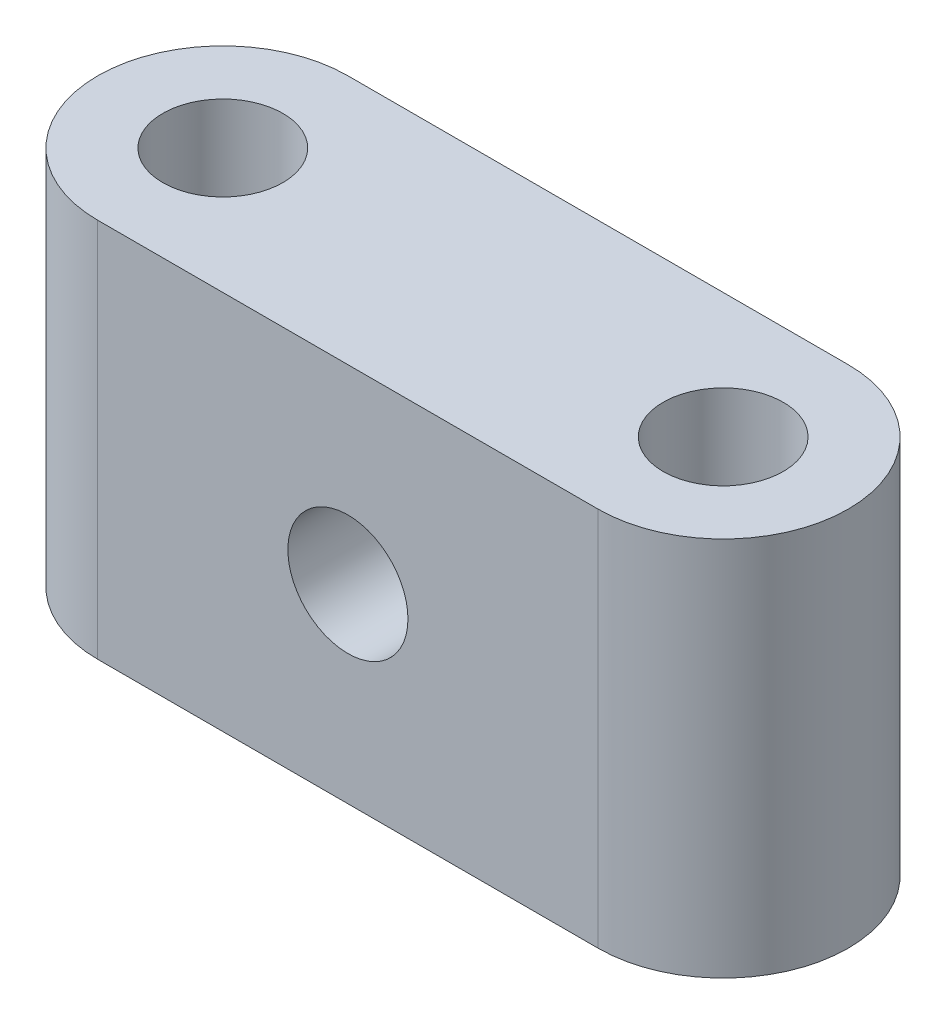
ISO-10303-21;
HEADER;
FILE_DESCRIPTION(('STEP AP214'),'2;1');
FILE_NAME('part.step','',(''),(''),'','','');
FILE_SCHEMA(('AUTOMOTIVE_DESIGN { 1 0 10303 214 1 1 1 1 }'));
ENDSEC;
DATA;
#1=APPLICATION_CONTEXT('core data for automotive mechanical design processes');
#2=APPLICATION_PROTOCOL_DEFINITION('international standard','automotive_design',2000,#1);
#3=PRODUCT_CONTEXT('',#1,'mechanical');
#4=PRODUCT('Part','Part','',(#3));
#5=PRODUCT_RELATED_PRODUCT_CATEGORY('part','',(#4));
#6=PRODUCT_DEFINITION_FORMATION('','',#4);
#7=PRODUCT_DEFINITION_CONTEXT('part definition',#1,'design');
#8=PRODUCT_DEFINITION('design','',#6,#7);
#9=PRODUCT_DEFINITION_SHAPE('','',#8);
#10=(LENGTH_UNIT() NAMED_UNIT(*) SI_UNIT(.MILLI.,.METRE.));
#11=(NAMED_UNIT(*) PLANE_ANGLE_UNIT() SI_UNIT($,.RADIAN.));
#12=(NAMED_UNIT(*) SI_UNIT($,.STERADIAN.) SOLID_ANGLE_UNIT());
#13=UNCERTAINTY_MEASURE_WITH_UNIT(LENGTH_MEASURE(1.E-05),#10,'distance_accuracy_value','');
#14=(GEOMETRIC_REPRESENTATION_CONTEXT(3) GLOBAL_UNCERTAINTY_ASSIGNED_CONTEXT((#13)) GLOBAL_UNIT_ASSIGNED_CONTEXT((#10,
#11,#12)) REPRESENTATION_CONTEXT('',''));
#15=CARTESIAN_POINT('',(0.,0.,0.));
#16=DIRECTION('',(0.,0.,1.));
#17=DIRECTION('',(1.,0.,0.));
#18=AXIS2_PLACEMENT_3D('',#15,#16,#17);
#19=CARTESIAN_POINT('',(0.,38.,0.));
#20=DIRECTION('',(0.,1.,0.));
#21=DIRECTION('',(0.,0.,1.));
#22=AXIS2_PLACEMENT_3D('',#19,#20,#21);
#23=PLANE('',#22);
#24=CARTESIAN_POINT('',(0.,38.,0.));
#25=DIRECTION('',(0.,1.,0.));
#26=DIRECTION('',(0.,0.,1.));
#27=AXIS2_PLACEMENT_3D('',#24,#25,#26);
#28=CIRCLE('',#27,6.);
#29=CARTESIAN_POINT('',(0.,38.,6.));
#30=VERTEX_POINT('',#29);
#31=EDGE_CURVE('E100',#30,#30,#28,.T.);
#32=ORIENTED_EDGE('',*,*,#31,.F.);
#33=EDGE_LOOP('',(#32));
#34=FACE_BOUND('',#33,.T.);
#35=CARTESIAN_POINT('',(0.,38.,0.));
#36=DIRECTION('',(0.,1.,0.));
#37=DIRECTION('',(0.,0.,1.));
#38=AXIS2_PLACEMENT_3D('',#35,#36,#37);
#39=CIRCLE('',#38,12.5);
#40=CARTESIAN_POINT('',(0.,38.,-12.5));
#41=VERTEX_POINT('',#40);
#42=CARTESIAN_POINT('',(0.,38.,12.5));
#43=VERTEX_POINT('',#42);
#44=EDGE_CURVE('E85',#41,#43,#39,.T.);
#45=ORIENTED_EDGE('',*,*,#44,.T.);
#46=DIRECTION('',(1.,0.,0.));
#47=VECTOR('',#46,1.);
#48=CARTESIAN_POINT('',(0.,38.,12.5));
#49=LINE('',#48,#47);
#50=CARTESIAN_POINT('',(50.,38.,12.5));
#51=VERTEX_POINT('',#50);
#52=EDGE_CURVE('E80',#43,#51,#49,.T.);
#53=ORIENTED_EDGE('',*,*,#52,.T.);
#54=CARTESIAN_POINT('',(50.,38.,0.));
#55=DIRECTION('',(0.,1.,0.));
#56=DIRECTION('',(0.,0.,1.));
#57=AXIS2_PLACEMENT_3D('',#54,#55,#56);
#58=CIRCLE('',#57,12.5);
#59=CARTESIAN_POINT('',(50.,38.,-12.5));
#60=VERTEX_POINT('',#59);
#61=EDGE_CURVE('E83',#51,#60,#58,.T.);
#62=ORIENTED_EDGE('',*,*,#61,.T.);
#63=DIRECTION('',(-1.,0.,0.));
#64=VECTOR('',#63,1.);
#65=CARTESIAN_POINT('',(0.,38.,-12.5));
#66=LINE('',#65,#64);
#67=EDGE_CURVE('E50',#60,#41,#66,.T.);
#68=ORIENTED_EDGE('',*,*,#67,.T.);
#69=EDGE_LOOP('',(#45,#53,#62,#68));
#70=FACE_BOUND('',#69,.T.);
#71=CARTESIAN_POINT('',(50.,38.,0.));
#72=DIRECTION('',(0.,1.,0.));
#73=DIRECTION('',(0.,0.,1.));
#74=AXIS2_PLACEMENT_3D('',#71,#72,#73);
#75=CIRCLE('',#74,6.);
#76=CARTESIAN_POINT('',(50.,38.,6.));
#77=VERTEX_POINT('',#76);
#78=EDGE_CURVE('E115',#77,#77,#75,.T.);
#79=ORIENTED_EDGE('',*,*,#78,.F.);
#80=EDGE_LOOP('',(#79));
#81=FACE_BOUND('',#80,.T.);
#82=ADVANCED_FACE('F33',(#34,#70,#81),#23,.T.);
#83=CARTESIAN_POINT('',(0.,0.,0.));
#84=DIRECTION('',(0.,1.,0.));
#85=DIRECTION('',(0.,0.,1.));
#86=AXIS2_PLACEMENT_3D('',#83,#84,#85);
#87=PLANE('',#86);
#88=CARTESIAN_POINT('',(0.,0.,0.));
#89=DIRECTION('',(0.,1.,0.));
#90=DIRECTION('',(0.,0.,1.));
#91=AXIS2_PLACEMENT_3D('',#88,#89,#90);
#92=CIRCLE('',#91,12.5);
#93=CARTESIAN_POINT('',(0.,0.,-12.5));
#94=VERTEX_POINT('',#93);
#95=CARTESIAN_POINT('',(0.,0.,12.5));
#96=VERTEX_POINT('',#95);
#97=EDGE_CURVE('E97',#94,#96,#92,.T.);
#98=ORIENTED_EDGE('',*,*,#97,.F.);
#99=DIRECTION('',(-1.,0.,0.));
#100=VECTOR('',#99,1.);
#101=CARTESIAN_POINT('',(0.,0.,-12.5));
#102=LINE('',#101,#100);
#103=CARTESIAN_POINT('',(50.,0.,-12.5));
#104=VERTEX_POINT('',#103);
#105=EDGE_CURVE('E73',#104,#94,#102,.T.);
#106=ORIENTED_EDGE('',*,*,#105,.F.);
#107=CARTESIAN_POINT('',(50.,0.,0.));
#108=DIRECTION('',(0.,1.,0.));
#109=DIRECTION('',(0.,0.,1.));
#110=AXIS2_PLACEMENT_3D('',#107,#108,#109);
#111=CIRCLE('',#110,12.5);
#112=CARTESIAN_POINT('',(50.,0.,12.5));
#113=VERTEX_POINT('',#112);
#114=EDGE_CURVE('E67',#113,#104,#111,.T.);
#115=ORIENTED_EDGE('',*,*,#114,.F.);
#116=DIRECTION('',(1.,0.,0.));
#117=VECTOR('',#116,1.);
#118=CARTESIAN_POINT('',(0.,0.,12.5));
#119=LINE('',#118,#117);
#120=EDGE_CURVE('E89',#96,#113,#119,.T.);
#121=ORIENTED_EDGE('',*,*,#120,.F.);
#122=EDGE_LOOP('',(#98,#106,#115,#121));
#123=FACE_BOUND('',#122,.T.);
#124=CARTESIAN_POINT('',(0.,0.,0.));
#125=DIRECTION('',(0.,1.,0.));
#126=DIRECTION('',(0.,0.,1.));
#127=AXIS2_PLACEMENT_3D('',#124,#125,#126);
#128=CIRCLE('',#127,6.);
#129=CARTESIAN_POINT('',(0.,0.,6.));
#130=VERTEX_POINT('',#129);
#131=EDGE_CURVE('E112',#130,#130,#128,.T.);
#132=ORIENTED_EDGE('',*,*,#131,.T.);
#133=EDGE_LOOP('',(#132));
#134=FACE_BOUND('',#133,.T.);
#135=CARTESIAN_POINT('',(50.,0.,0.));
#136=DIRECTION('',(0.,1.,0.));
#137=DIRECTION('',(0.,0.,1.));
#138=AXIS2_PLACEMENT_3D('',#135,#136,#137);
#139=CIRCLE('',#138,6.);
#140=CARTESIAN_POINT('',(50.,0.,6.));
#141=VERTEX_POINT('',#140);
#142=EDGE_CURVE('E118',#141,#141,#139,.T.);
#143=ORIENTED_EDGE('',*,*,#142,.T.);
#144=EDGE_LOOP('',(#143));
#145=FACE_BOUND('',#144,.T.);
#146=ADVANCED_FACE('F108',(#123,#134,#145),#87,.F.);
#147=CARTESIAN_POINT('',(0.,38.,0.));
#148=DIRECTION('',(0.,-1.,0.));
#149=DIRECTION('',(0.,0.,-1.));
#150=AXIS2_PLACEMENT_3D('',#147,#148,#149);
#151=CYLINDRICAL_SURFACE('',#150,12.5);
#152=ORIENTED_EDGE('',*,*,#97,.T.);
#153=DIRECTION('',(0.,-1.,0.));
#154=VECTOR('',#153,1.);
#155=CARTESIAN_POINT('',(0.,38.,12.5));
#156=LINE('',#155,#154);
#157=EDGE_CURVE('E11',#43,#96,#156,.T.);
#158=ORIENTED_EDGE('',*,*,#157,.F.);
#159=ORIENTED_EDGE('',*,*,#44,.F.);
#160=DIRECTION('',(0.,-1.,0.));
#161=VECTOR('',#160,1.);
#162=CARTESIAN_POINT('',(0.,38.,-12.5));
#163=LINE('',#162,#161);
#164=EDGE_CURVE('E93',#41,#94,#163,.T.);
#165=ORIENTED_EDGE('',*,*,#164,.T.);
#166=EDGE_LOOP('',(#152,#158,#159,#165));
#167=FACE_BOUND('',#166,.T.);
#168=ADVANCED_FACE('F35',(#167),#151,.T.);
#169=CARTESIAN_POINT('',(0.,38.,12.5));
#170=DIRECTION('',(0.,0.,-1.));
#171=DIRECTION('',(-1.,0.,0.));
#172=AXIS2_PLACEMENT_3D('',#169,#170,#171);
#173=PLANE('',#172);
#174=CARTESIAN_POINT('',(25.,19.,12.5));
#175=DIRECTION('',(0.,0.,1.));
#176=DIRECTION('',(1.,0.,0.));
#177=AXIS2_PLACEMENT_3D('',#174,#175,#176);
#178=CIRCLE('',#177,6.);
#179=CARTESIAN_POINT('',(31.,19.,12.5));
#180=VERTEX_POINT('',#179);
#181=EDGE_CURVE('E124',#180,#180,#178,.T.);
#182=ORIENTED_EDGE('',*,*,#181,.F.);
#183=EDGE_LOOP('',(#182));
#184=FACE_BOUND('',#183,.T.);
#185=ORIENTED_EDGE('',*,*,#120,.T.);
#186=DIRECTION('',(0.,-1.,0.));
#187=VECTOR('',#186,1.);
#188=CARTESIAN_POINT('',(50.,38.,12.5));
#189=LINE('',#188,#187);
#190=EDGE_CURVE('E42',#51,#113,#189,.T.);
#191=ORIENTED_EDGE('',*,*,#190,.F.);
#192=ORIENTED_EDGE('',*,*,#52,.F.);
#193=ORIENTED_EDGE('',*,*,#157,.T.);
#194=EDGE_LOOP('',(#185,#191,#192,#193));
#195=FACE_BOUND('',#194,.T.);
#196=ADVANCED_FACE('F88',(#184,#195),#173,.F.);
#197=CARTESIAN_POINT('',(50.,38.,0.));
#198=DIRECTION('',(0.,-1.,0.));
#199=DIRECTION('',(0.,0.,-1.));
#200=AXIS2_PLACEMENT_3D('',#197,#198,#199);
#201=CYLINDRICAL_SURFACE('',#200,12.5);
#202=ORIENTED_EDGE('',*,*,#114,.T.);
#203=DIRECTION('',(0.,-1.,0.));
#204=VECTOR('',#203,1.);
#205=CARTESIAN_POINT('',(50.,38.,-12.5));
#206=LINE('',#205,#204);
#207=EDGE_CURVE('E90',#60,#104,#206,.T.);
#208=ORIENTED_EDGE('',*,*,#207,.F.);
#209=ORIENTED_EDGE('',*,*,#61,.F.);
#210=ORIENTED_EDGE('',*,*,#190,.T.);
#211=EDGE_LOOP('',(#202,#208,#209,#210));
#212=FACE_BOUND('',#211,.T.);
#213=ADVANCED_FACE('F91',(#212),#201,.T.);
#214=CARTESIAN_POINT('',(0.,38.,-12.5));
#215=DIRECTION('',(0.,0.,1.));
#216=DIRECTION('',(1.,0.,0.));
#217=AXIS2_PLACEMENT_3D('',#214,#215,#216);
#218=PLANE('',#217);
#219=ORIENTED_EDGE('',*,*,#105,.T.);
#220=ORIENTED_EDGE('',*,*,#164,.F.);
#221=ORIENTED_EDGE('',*,*,#67,.F.);
#222=ORIENTED_EDGE('',*,*,#207,.T.);
#223=EDGE_LOOP('',(#219,#220,#221,#222));
#224=FACE_BOUND('',#223,.T.);
#225=ADVANCED_FACE('F105',(#224),#218,.F.);
#226=CARTESIAN_POINT('',(0.,38.,0.));
#227=DIRECTION('',(0.,-1.,0.));
#228=DIRECTION('',(0.,0.,-1.));
#229=AXIS2_PLACEMENT_3D('',#226,#227,#228);
#230=CYLINDRICAL_SURFACE('',#229,6.);
#231=ORIENTED_EDGE('',*,*,#31,.T.);
#232=EDGE_LOOP('',(#231));
#233=FACE_BOUND('',#232,.T.);
#234=ORIENTED_EDGE('',*,*,#131,.F.);
#235=EDGE_LOOP('',(#234));
#236=FACE_BOUND('',#235,.T.);
#237=ADVANCED_FACE('F154',(#233,#236),#230,.F.);
#238=CARTESIAN_POINT('',(50.,38.,0.));
#239=DIRECTION('',(0.,-1.,0.));
#240=DIRECTION('',(0.,0.,-1.));
#241=AXIS2_PLACEMENT_3D('',#238,#239,#240);
#242=CYLINDRICAL_SURFACE('',#241,6.);
#243=ORIENTED_EDGE('',*,*,#78,.T.);
#244=EDGE_LOOP('',(#243));
#245=FACE_BOUND('',#244,.T.);
#246=ORIENTED_EDGE('',*,*,#142,.F.);
#247=EDGE_LOOP('',(#246));
#248=FACE_BOUND('',#247,.T.);
#249=ADVANCED_FACE('F135',(#245,#248),#242,.F.);
#250=CARTESIAN_POINT('',(25.,19.,0.));
#251=DIRECTION('',(0.,0.,1.));
#252=DIRECTION('',(1.,0.,0.));
#253=AXIS2_PLACEMENT_3D('',#250,#251,#252);
#254=CYLINDRICAL_SURFACE('',#253,6.);
#255=CARTESIAN_POINT('',(25.,19.,0.));
#256=DIRECTION('',(0.,0.,1.));
#257=DIRECTION('',(1.,0.,0.));
#258=AXIS2_PLACEMENT_3D('',#255,#256,#257);
#259=CIRCLE('',#258,6.);
#260=CARTESIAN_POINT('',(31.,19.,0.));
#261=VERTEX_POINT('',#260);
#262=EDGE_CURVE('E121',#261,#261,#259,.T.);
#263=ORIENTED_EDGE('',*,*,#262,.F.);
#264=EDGE_LOOP('',(#263));
#265=FACE_BOUND('',#264,.T.);
#266=ORIENTED_EDGE('',*,*,#181,.T.);
#267=EDGE_LOOP('',(#266));
#268=FACE_BOUND('',#267,.T.);
#269=ADVANCED_FACE('F132',(#265,#268),#254,.F.);
#270=CARTESIAN_POINT('',(25.,19.,0.));
#271=DIRECTION('',(0.,0.,1.));
#272=DIRECTION('',(1.,0.,0.));
#273=AXIS2_PLACEMENT_3D('',#270,#271,#272);
#274=PLANE('',#273);
#275=ORIENTED_EDGE('',*,*,#262,.T.);
#276=EDGE_LOOP('',(#275));
#277=FACE_BOUND('',#276,.T.);
#278=ADVANCED_FACE('F130',(#277),#274,.T.);
#279=CLOSED_SHELL('',(#82,#146,#168,#196,#213,#225,#237,#249,#269,#278));
#280=MANIFOLD_SOLID_BREP('B2',#279);
#281=ADVANCED_BREP_SHAPE_REPRESENTATION('',(#18,#280),#14);
#282=SHAPE_DEFINITION_REPRESENTATION(#9,#281);
ENDSEC;
END-ISO-10303-21;
